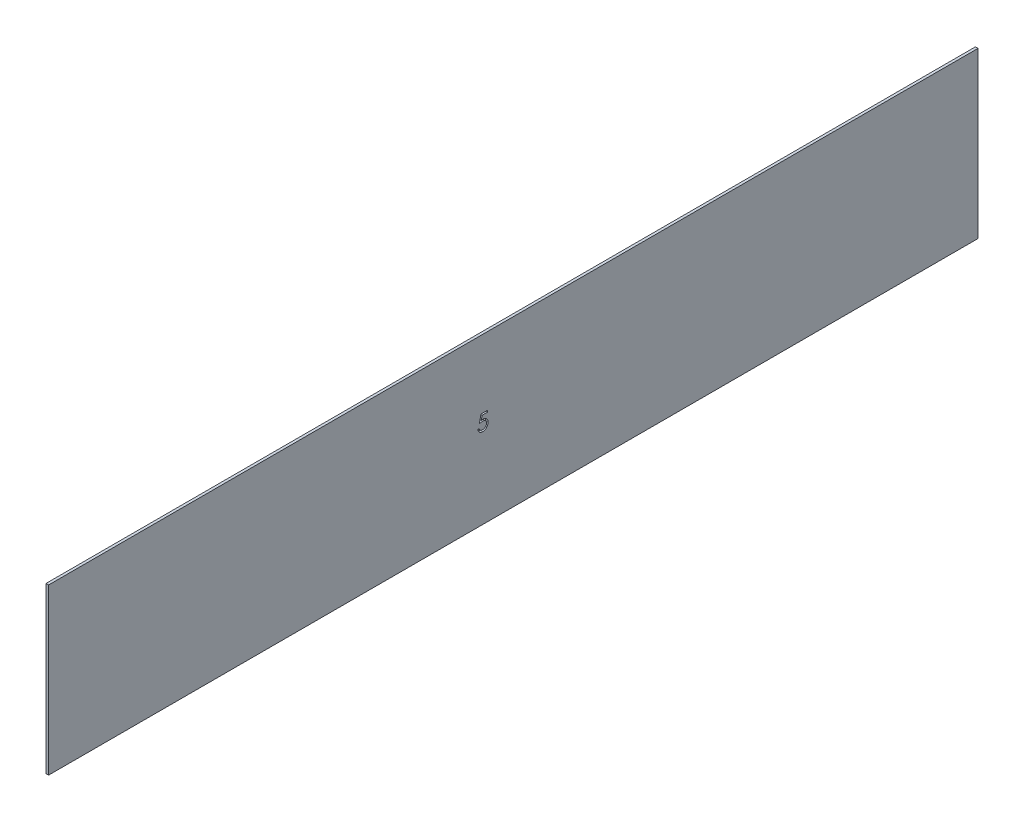
ISO-10303-21;
HEADER;
FILE_DESCRIPTION(('STEP AP214'),'2;1');
FILE_NAME('part.step','',(''),(''),'','','');
FILE_SCHEMA(('AUTOMOTIVE_DESIGN { 1 0 10303 214 1 1 1 1 }'));
ENDSEC;
DATA;
#1=APPLICATION_CONTEXT('core data for automotive mechanical design processes');
#2=APPLICATION_PROTOCOL_DEFINITION('international standard','automotive_design',2000,#1);
#3=PRODUCT_CONTEXT('',#1,'mechanical');
#4=PRODUCT('Part','Part','',(#3));
#5=PRODUCT_RELATED_PRODUCT_CATEGORY('part','',(#4));
#6=PRODUCT_DEFINITION_FORMATION('','',#4);
#7=PRODUCT_DEFINITION_CONTEXT('part definition',#1,'design');
#8=PRODUCT_DEFINITION('design','',#6,#7);
#9=PRODUCT_DEFINITION_SHAPE('','',#8);
#10=(LENGTH_UNIT() NAMED_UNIT(*) SI_UNIT(.MILLI.,.METRE.));
#11=(NAMED_UNIT(*) PLANE_ANGLE_UNIT() SI_UNIT($,.RADIAN.));
#12=(NAMED_UNIT(*) SI_UNIT($,.STERADIAN.) SOLID_ANGLE_UNIT());
#13=UNCERTAINTY_MEASURE_WITH_UNIT(LENGTH_MEASURE(1.E-05),#10,'distance_accuracy_value','');
#14=(GEOMETRIC_REPRESENTATION_CONTEXT(3) GLOBAL_UNCERTAINTY_ASSIGNED_CONTEXT((#13)) GLOBAL_UNIT_ASSIGNED_CONTEXT((#10,
#11,#12)) REPRESENTATION_CONTEXT('',''));
#15=CARTESIAN_POINT('',(0.,0.,0.));
#16=DIRECTION('',(0.,0.,1.));
#17=DIRECTION('',(1.,0.,0.));
#18=AXIS2_PLACEMENT_3D('',#15,#16,#17);
#19=CARTESIAN_POINT('',(0.,-91.3161345811033,-1228.84437187374));
#20=CARTESIAN_POINT('',(0.,-91.3192946558324,-1228.69671298981));
#21=CARTESIAN_POINT('',(0.,-91.3258194084311,-1228.39183485582));
#22=CARTESIAN_POINT('',(0.,-91.3738607697288,-1227.92416918463));
#23=CARTESIAN_POINT('',(0.,-91.4513632151162,-1227.43272423528));
#24=CARTESIAN_POINT('',(0.,-91.5579683620556,-1226.91938390947));
#25=CARTESIAN_POINT('',(0.,-91.6974746512704,-1226.38260657251));
#26=CARTESIAN_POINT('',(0.,-91.8646492903896,-1225.82352499141));
#27=CARTESIAN_POINT('',(0.,-92.0645218833878,-1225.24096365463));
#28=CARTESIAN_POINT('',(0.,-92.2154643610661,-1224.84843718326));
#29=CARTESIAN_POINT('',(0.,-92.2930576580264,-1224.64665552758));
#30=B_SPLINE_CURVE_WITH_KNOTS('',3,(#19,#20,#21,#22,#23,#24,#25,#26,#27,#28,#29),.UNSPECIFIED.,
.F.,.F.,(4,1,1,1,1,1,1,1,4),(0.,0.102203037035223,0.211023342373878,0.325099661565207,
0.446502097134894,0.573787717648855,0.708900709766069,0.850357871293403,1.),.UNSPECIFIED.);
#31=DIRECTION('',(1.,0.,0.));
#32=VECTOR('',#31,1.);
#33=SURFACE_OF_LINEAR_EXTRUSION('',#30,#32);
#34=DIRECTION('',(-1.,0.,0.));
#35=VECTOR('',#34,1.);
#36=CARTESIAN_POINT('',(0.,-92.2930576580264,-1224.64665552758));
#37=LINE('',#36,#35);
#38=CARTESIAN_POINT('',(3.175,-92.2930576580264,-1224.64665552758));
#39=VERTEX_POINT('',#38);
#40=CARTESIAN_POINT('',(0.,-92.2930576580264,-1224.64665552758));
#41=VERTEX_POINT('',#40);
#42=EDGE_CURVE('E11',#39,#41,#37,.T.);
#43=ORIENTED_EDGE('',*,*,#42,.F.);
#44=CARTESIAN_POINT('',(3.175,-91.3161345811033,-1228.84437187374));
#45=CARTESIAN_POINT('',(3.175,-91.3192946558324,-1228.69671298981));
#46=CARTESIAN_POINT('',(3.175,-91.3258194084311,-1228.39183485582));
#47=CARTESIAN_POINT('',(3.175,-91.3738607697288,-1227.92416918463));
#48=CARTESIAN_POINT('',(3.175,-91.4513632151162,-1227.43272423528));
#49=CARTESIAN_POINT('',(3.175,-91.5579683620556,-1226.91938390947));
#50=CARTESIAN_POINT('',(3.175,-91.6974746512704,-1226.38260657251));
#51=CARTESIAN_POINT('',(3.175,-91.8646492903896,-1225.82352499141));
#52=CARTESIAN_POINT('',(3.175,-92.0645218833878,-1225.24096365463));
#53=CARTESIAN_POINT('',(3.175,-92.2154643610661,-1224.84843718326));
#54=CARTESIAN_POINT('',(3.175,-92.2930576580264,-1224.64665552758));
#55=B_SPLINE_CURVE_WITH_KNOTS('',3,(#44,#45,#46,#47,#48,#49,#50,#51,#52,#53,#54),.UNSPECIFIED.,
.F.,.F.,(4,1,1,1,1,1,1,1,4),(0.,0.102203037035223,0.211023342373878,0.325099661565207,
0.446502097134894,0.573787717648855,0.708900709766069,0.850357871293403,1.),.UNSPECIFIED.);
#56=CARTESIAN_POINT('',(3.175,-91.3161345811033,-1228.84437187374));
#57=VERTEX_POINT('',#56);
#58=EDGE_CURVE('E143',#57,#39,#55,.T.);
#59=ORIENTED_EDGE('',*,*,#58,.F.);
#60=DIRECTION('',(-1.,0.,0.));
#61=VECTOR('',#60,1.);
#62=CARTESIAN_POINT('',(0.,-91.3161345811033,-1228.84437187374));
#63=LINE('',#62,#61);
#64=CARTESIAN_POINT('',(0.,-91.3161345811033,-1228.84437187374));
#65=VERTEX_POINT('',#64);
#66=EDGE_CURVE('E55',#57,#65,#63,.T.);
#67=ORIENTED_EDGE('',*,*,#66,.T.);
#68=EDGE_CURVE('E274',#65,#41,#30,.T.);
#69=ORIENTED_EDGE('',*,*,#68,.T.);
#70=EDGE_LOOP('',(#43,#59,#67,#69));
#71=FACE_BOUND('',#70,.T.);
#72=ADVANCED_FACE('F45',(#71),#33,.T.);
#73=CARTESIAN_POINT('',(0.,-95.5214831387956,-1233.43896321989));
#74=CARTESIAN_POINT('',(0.,-95.3686708335431,-1233.43537921025));
#75=CARTESIAN_POINT('',(0.,-95.0695624888284,-1233.42836402133));
#76=CARTESIAN_POINT('',(0.,-94.6319610937697,-1233.37104763154));
#77=CARTESIAN_POINT('',(0.,-94.2179063920996,-1233.27135096773));
#78=CARTESIAN_POINT('',(0.,-93.8253989186236,-1233.13297242116));
#79=CARTESIAN_POINT('',(0.,-93.4540684681293,-1232.95727967192));
#80=CARTESIAN_POINT('',(0.,-93.1035318118968,-1232.74257902916));
#81=CARTESIAN_POINT('',(0.,-92.7784090910661,-1232.48484124892));
#82=CARTESIAN_POINT('',(0.,-92.4785481921344,-1232.19042682675));
#83=CARTESIAN_POINT('',(0.,-92.2018068017536,-1231.86789377533));
#84=CARTESIAN_POINT('',(0.,-91.965891131208,-1231.51169283348));
#85=CARTESIAN_POINT('',(0.,-91.7674232365602,-1231.12927808907));
#86=CARTESIAN_POINT('',(0.,-91.5961474170089,-1230.72525698339));
#87=CARTESIAN_POINT('',(0.,-91.4731347884782,-1230.29001946393));
#88=CARTESIAN_POINT('',(0.,-91.3807810120005,-1229.83218465055));
#89=CARTESIAN_POINT('',(0.,-91.3273573951374,-1229.34680856873));
#90=CARTESIAN_POINT('',(0.,-91.3199448312636,-1229.01495382331));
#91=CARTESIAN_POINT('',(0.,-91.3161345811033,-1228.84437187374));
#92=B_SPLINE_CURVE_WITH_KNOTS('',3,(#73,#74,#75,#76,#77,#78,#79,#80,#81,#82,#83,#84,#85,#86,#87,
#88,#89,#90,#91),.UNSPECIFIED.,.F.,.F.,(4,1,1,1,1,1,1,1,1,1,1,1,1,1,1,1,4),(0.,
0.0653513820265936,0.127916031830613,0.1883602055717,0.247216077265452,0.305630129197413,
0.363769839831819,0.422660913912781,0.482687294090392,0.54330022123956,0.604117955323103,
0.664964891265284,0.727413494112564,0.791467625149423,0.858055442729101,0.92703681461495,1.),.UNSPECIFIED.);
#93=DIRECTION('',(1.,0.,0.));
#94=VECTOR('',#93,1.);
#95=SURFACE_OF_LINEAR_EXTRUSION('',#92,#94);
#96=ORIENTED_EDGE('',*,*,#66,.F.);
#97=CARTESIAN_POINT('',(3.175,-95.5214831387956,-1233.43896321989));
#98=CARTESIAN_POINT('',(3.175,-95.3686708335431,-1233.43537921025));
#99=CARTESIAN_POINT('',(3.175,-95.0695624888284,-1233.42836402133));
#100=CARTESIAN_POINT('',(3.175,-94.6319610937697,-1233.37104763154));
#101=CARTESIAN_POINT('',(3.175,-94.2179063920996,-1233.27135096773));
#102=CARTESIAN_POINT('',(3.175,-93.8253989186236,-1233.13297242116));
#103=CARTESIAN_POINT('',(3.175,-93.4540684681293,-1232.95727967192));
#104=CARTESIAN_POINT('',(3.175,-93.1035318118968,-1232.74257902916));
#105=CARTESIAN_POINT('',(3.175,-92.7784090910661,-1232.48484124892));
#106=CARTESIAN_POINT('',(3.175,-92.4785481921344,-1232.19042682675));
#107=CARTESIAN_POINT('',(3.175,-92.2018068017536,-1231.86789377533));
#108=CARTESIAN_POINT('',(3.175,-91.965891131208,-1231.51169283348));
#109=CARTESIAN_POINT('',(3.175,-91.7674232365602,-1231.12927808907));
#110=CARTESIAN_POINT('',(3.175,-91.5961474170089,-1230.72525698339));
#111=CARTESIAN_POINT('',(3.175,-91.4731347884782,-1230.29001946393));
#112=CARTESIAN_POINT('',(3.175,-91.3807810120005,-1229.83218465055));
#113=CARTESIAN_POINT('',(3.175,-91.3273573951374,-1229.34680856873));
#114=CARTESIAN_POINT('',(3.175,-91.3199448312636,-1229.01495382331));
#115=CARTESIAN_POINT('',(3.175,-91.3161345811033,-1228.84437187374));
#116=B_SPLINE_CURVE_WITH_KNOTS('',3,(#97,#98,#99,#100,#101,#102,#103,#104,#105,#106,#107,#108,
#109,#110,#111,#112,#113,#114,#115),.UNSPECIFIED.,.F.,.F.,(4,1,1,1,1,1,1,1,1,1,1,1,1,1,1,1,4),
(0.,0.0653513820265936,0.127916031830613,0.1883602055717,0.247216077265452,0.305630129197413,
0.363769839831819,0.422660913912781,0.482687294090392,0.54330022123956,0.604117955323103,
0.664964891265284,0.727413494112564,0.791467625149423,0.858055442729101,0.92703681461495,1.),.UNSPECIFIED.);
#117=CARTESIAN_POINT('',(3.175,-95.5214831387956,-1233.43896321989));
#118=VERTEX_POINT('',#117);
#119=EDGE_CURVE('E212',#118,#57,#116,.T.);
#120=ORIENTED_EDGE('',*,*,#119,.F.);
#121=DIRECTION('',(-1.,0.,0.));
#122=VECTOR('',#121,1.);
#123=CARTESIAN_POINT('',(0.,-95.5214831387956,-1233.43896321989));
#124=LINE('',#123,#122);
#125=CARTESIAN_POINT('',(0.,-95.5214831387956,-1233.43896321989));
#126=VERTEX_POINT('',#125);
#127=EDGE_CURVE('E267',#118,#126,#124,.T.);
#128=ORIENTED_EDGE('',*,*,#127,.T.);
#129=EDGE_CURVE('E284',#126,#65,#92,.T.);
#130=ORIENTED_EDGE('',*,*,#129,.T.);
#131=EDGE_LOOP('',(#96,#120,#128,#130));
#132=FACE_BOUND('',#131,.T.);
#133=ADVANCED_FACE('F287',(#132),#95,.T.);
#134=CARTESIAN_POINT('',(0.,-100.352673042642,-1228.60395721028));
#135=CARTESIAN_POINT('',(0.,-100.348205665758,-1228.76701674346));
#136=CARTESIAN_POINT('',(0.,-100.339409364121,-1229.08808229852));
#137=CARTESIAN_POINT('',(0.,-100.271705598318,-1229.56058427466));
#138=CARTESIAN_POINT('',(0.,-100.167433674486,-1230.01676577567));
#139=CARTESIAN_POINT('',(0.,-100.011387749503,-1230.45212553175));
#140=CARTESIAN_POINT('',(0.,-99.8217329249283,-1230.87428191151));
#141=CARTESIAN_POINT('',(0.,-99.5783551551305,-1231.27255629053));
#142=CARTESIAN_POINT('',(0.,-99.2982656261655,-1231.65847052182));
#143=CARTESIAN_POINT('',(0.,-98.977373111215,-1232.02002936284));
#144=CARTESIAN_POINT('',(0.,-98.6237523447874,-1232.35116979381));
#145=CARTESIAN_POINT('',(0.,-98.2455968177175,-1232.6437566817));
#146=CARTESIAN_POINT('',(0.,-97.8421894101056,-1232.88747102478));
#147=CARTESIAN_POINT('',(0.,-97.4205141067313,-1233.09285238877));
#148=CARTESIAN_POINT('',(0.,-96.9759493883744,-1233.24880820093));
#149=CARTESIAN_POINT('',(0.,-96.5105787063644,-1233.36006554159));
#150=CARTESIAN_POINT('',(0.,-96.0232525998123,-1233.42539647601));
#151=CARTESIAN_POINT('',(0.,-95.6908610708874,-1233.43438361272));
#152=CARTESIAN_POINT('',(0.,-95.5214831387956,-1233.43896321989));
#153=B_SPLINE_CURVE_WITH_KNOTS('',3,(#134,#135,#136,#137,#138,#139,#140,#141,#142,#143,#144,
#145,#146,#147,#148,#149,#150,#151,#152),.UNSPECIFIED.,.F.,.F.,(4,1,1,1,1,1,1,1,1,1,1,1,1,1,1,1,
4),(0.,0.064207295282987,0.126424689779743,0.187680284264923,0.248216424455216,
0.308305060008616,0.369660991325144,0.431698551786783,0.495946892208766,0.559758023972119,
0.622295407826159,0.683910635284175,0.745092408056624,0.806740225389292,0.869086618121201,
0.9332900029748,1.),.UNSPECIFIED.);
#154=DIRECTION('',(1.,0.,0.));
#155=VECTOR('',#154,1.);
#156=SURFACE_OF_LINEAR_EXTRUSION('',#153,#155);
#157=ORIENTED_EDGE('',*,*,#127,.F.);
#158=CARTESIAN_POINT('',(3.175,-100.352673042642,-1228.60395721028));
#159=CARTESIAN_POINT('',(3.175,-100.348205665758,-1228.76701674346));
#160=CARTESIAN_POINT('',(3.175,-100.339409364121,-1229.08808229852));
#161=CARTESIAN_POINT('',(3.175,-100.271705598318,-1229.56058427466));
#162=CARTESIAN_POINT('',(3.175,-100.167433674486,-1230.01676577567));
#163=CARTESIAN_POINT('',(3.175,-100.011387749503,-1230.45212553175));
#164=CARTESIAN_POINT('',(3.175,-99.8217329249283,-1230.87428191151));
#165=CARTESIAN_POINT('',(3.175,-99.5783551551305,-1231.27255629053));
#166=CARTESIAN_POINT('',(3.175,-99.2982656261655,-1231.65847052182));
#167=CARTESIAN_POINT('',(3.175,-98.977373111215,-1232.02002936284));
#168=CARTESIAN_POINT('',(3.175,-98.6237523447874,-1232.35116979381));
#169=CARTESIAN_POINT('',(3.175,-98.2455968177175,-1232.6437566817));
#170=CARTESIAN_POINT('',(3.175,-97.8421894101056,-1232.88747102478));
#171=CARTESIAN_POINT('',(3.175,-97.4205141067313,-1233.09285238877));
#172=CARTESIAN_POINT('',(3.175,-96.9759493883744,-1233.24880820093));
#173=CARTESIAN_POINT('',(3.175,-96.5105787063644,-1233.36006554159));
#174=CARTESIAN_POINT('',(3.175,-96.0232525998123,-1233.42539647601));
#175=CARTESIAN_POINT('',(3.175,-95.6908610708874,-1233.43438361272));
#176=CARTESIAN_POINT('',(3.175,-95.5214831387956,-1233.43896321989));
#177=B_SPLINE_CURVE_WITH_KNOTS('',3,(#158,#159,#160,#161,#162,#163,#164,#165,#166,#167,#168,
#169,#170,#171,#172,#173,#174,#175,#176),.UNSPECIFIED.,.F.,.F.,(4,1,1,1,1,1,1,1,1,1,1,1,1,1,1,1,
4),(0.,0.064207295282987,0.126424689779743,0.187680284264923,0.248216424455216,
0.308305060008616,0.369660991325144,0.431698551786783,0.495946892208766,0.559758023972119,
0.622295407826159,0.683910635284175,0.745092408056624,0.806740225389292,0.869086618121201,
0.9332900029748,1.),.UNSPECIFIED.);
#178=CARTESIAN_POINT('',(3.175,-100.352673042642,-1228.60395721028));
#179=VERTEX_POINT('',#178);
#180=EDGE_CURVE('E204',#179,#118,#177,.T.);
#181=ORIENTED_EDGE('',*,*,#180,.F.);
#182=DIRECTION('',(-1.,0.,0.));
#183=VECTOR('',#182,1.);
#184=CARTESIAN_POINT('',(0.,-100.352673042642,-1228.60395721028));
#185=LINE('',#184,#183);
#186=CARTESIAN_POINT('',(0.,-100.352673042642,-1228.60395721028));
#187=VERTEX_POINT('',#186);
#188=EDGE_CURVE('E264',#179,#187,#185,.T.);
#189=ORIENTED_EDGE('',*,*,#188,.T.);
#190=EDGE_CURVE('E288',#187,#126,#153,.T.);
#191=ORIENTED_EDGE('',*,*,#190,.T.);
#192=EDGE_LOOP('',(#157,#181,#189,#191));
#193=FACE_BOUND('',#192,.T.);
#194=ADVANCED_FACE('F309',(#193),#156,.T.);
#195=CARTESIAN_POINT('',(0.,-96.933442273411,-1224.40242475835));
#196=CARTESIAN_POINT('',(0.,-97.1151055360244,-1224.44449019215));
#197=CARTESIAN_POINT('',(0.,-97.4642724138275,-1224.52534229163));
#198=CARTESIAN_POINT('',(0.,-97.9548444287975,-1224.70281072413));
#199=CARTESIAN_POINT('',(0.,-98.3920104890912,-1224.9197949892));
#200=CARTESIAN_POINT('',(0.,-98.7815535066229,-1225.17781008558));
#201=CARTESIAN_POINT('',(0.,-99.1212367632051,-1225.48560382295));
#202=CARTESIAN_POINT('',(0.,-99.4239524860378,-1225.83682828618));
#203=CARTESIAN_POINT('',(0.,-99.697048547092,-1226.23060660816));
#204=CARTESIAN_POINT('',(0.,-99.9246838942659,-1226.66817547169));
#205=CARTESIAN_POINT('',(0.,-100.118823823486,-1227.12980094628));
#206=CARTESIAN_POINT('',(0.,-100.248100906009,-1227.61294818933));
#207=CARTESIAN_POINT('',(0.,-100.33900147991,-1228.10446184655));
#208=CARTESIAN_POINT('',(0.,-100.348100635131,-1228.43690269005));
#209=CARTESIAN_POINT('',(0.,-100.352673042642,-1228.60395721028));
#210=B_SPLINE_CURVE_WITH_KNOTS('',3,(#195,#196,#197,#198,#199,#200,#201,#202,#203,#204,#205,
#206,#207,#208,#209),.UNSPECIFIED.,.F.,.F.,(4,1,1,1,1,1,1,1,1,1,1,1,4),(0.,0.0946872518675544,
0.181994155707275,0.264376948610513,0.342179861947775,0.418617610862148,0.496509075371912,
0.577369091611736,0.661510592454202,0.746732550829199,0.831257984327746,0.915205616213655,1.),.UNSPECIFIED.);
#211=DIRECTION('',(1.,0.,0.));
#212=VECTOR('',#211,1.);
#213=SURFACE_OF_LINEAR_EXTRUSION('',#210,#212);
#214=ORIENTED_EDGE('',*,*,#188,.F.);
#215=CARTESIAN_POINT('',(3.175,-96.933442273411,-1224.40242475835));
#216=CARTESIAN_POINT('',(3.175,-97.1151055360244,-1224.44449019215));
#217=CARTESIAN_POINT('',(3.175,-97.4642724138275,-1224.52534229163));
#218=CARTESIAN_POINT('',(3.175,-97.9548444287975,-1224.70281072413));
#219=CARTESIAN_POINT('',(3.175,-98.3920104890912,-1224.9197949892));
#220=CARTESIAN_POINT('',(3.175,-98.7815535066229,-1225.17781008558));
#221=CARTESIAN_POINT('',(3.175,-99.1212367632051,-1225.48560382295));
#222=CARTESIAN_POINT('',(3.175,-99.4239524860378,-1225.83682828618));
#223=CARTESIAN_POINT('',(3.175,-99.697048547092,-1226.23060660816));
#224=CARTESIAN_POINT('',(3.175,-99.9246838942659,-1226.66817547169));
#225=CARTESIAN_POINT('',(3.175,-100.118823823486,-1227.12980094628));
#226=CARTESIAN_POINT('',(3.175,-100.248100906009,-1227.61294818933));
#227=CARTESIAN_POINT('',(3.175,-100.33900147991,-1228.10446184655));
#228=CARTESIAN_POINT('',(3.175,-100.348100635131,-1228.43690269005));
#229=CARTESIAN_POINT('',(3.175,-100.352673042642,-1228.60395721028));
#230=B_SPLINE_CURVE_WITH_KNOTS('',3,(#215,#216,#217,#218,#219,#220,#221,#222,#223,#224,#225,
#226,#227,#228,#229),.UNSPECIFIED.,.F.,.F.,(4,1,1,1,1,1,1,1,1,1,1,1,4),(0.,0.0946872518675544,
0.181994155707275,0.264376948610513,0.342179861947775,0.418617610862148,0.496509075371912,
0.577369091611736,0.661510592454202,0.746732550829199,0.831257984327746,0.915205616213655,1.),.UNSPECIFIED.);
#231=CARTESIAN_POINT('',(3.175,-96.933442273411,-1224.40242475835));
#232=VERTEX_POINT('',#231);
#233=EDGE_CURVE('E199',#232,#179,#230,.T.);
#234=ORIENTED_EDGE('',*,*,#233,.F.);
#235=DIRECTION('',(-1.,0.,0.));
#236=VECTOR('',#235,1.);
#237=CARTESIAN_POINT('',(0.,-96.933442273411,-1224.40242475835));
#238=LINE('',#237,#236);
#239=CARTESIAN_POINT('',(0.,-96.933442273411,-1224.40242475835));
#240=VERTEX_POINT('',#239);
#241=EDGE_CURVE('E261',#232,#240,#238,.T.);
#242=ORIENTED_EDGE('',*,*,#241,.T.);
#243=EDGE_CURVE('E290',#240,#187,#210,.T.);
#244=ORIENTED_EDGE('',*,*,#243,.T.);
#245=EDGE_LOOP('',(#214,#234,#242,#244));
#246=FACE_BOUND('',#245,.T.);
#247=ADVANCED_FACE('F330',(#246),#213,.T.);
#248=CARTESIAN_POINT('',(0.,-96.933442273411,-1222.69280937374));
#249=DIRECTION('',(0.,-1.,0.));
#250=DIRECTION('',(0.,0.,-1.));
#251=AXIS2_PLACEMENT_3D('',#248,#249,#250);
#252=PLANE('',#251);
#253=ORIENTED_EDGE('',*,*,#241,.F.);
#254=DIRECTION('',(0.,0.,1.));
#255=VECTOR('',#254,1.);
#256=CARTESIAN_POINT('',(3.175,-96.933442273411,-2105.025));
#257=LINE('',#256,#255);
#258=CARTESIAN_POINT('',(3.175,-96.933442273411,-1222.69280937374));
#259=VERTEX_POINT('',#258);
#260=EDGE_CURVE('E193',#259,#232,#257,.F.);
#261=ORIENTED_EDGE('',*,*,#260,.F.);
#262=DIRECTION('',(-1.,0.,0.));
#263=VECTOR('',#262,1.);
#264=CARTESIAN_POINT('',(0.,-96.933442273411,-1222.69280937374));
#265=LINE('',#264,#263);
#266=CARTESIAN_POINT('',(0.,-96.933442273411,-1222.69280937374));
#267=VERTEX_POINT('',#266);
#268=EDGE_CURVE('E258',#259,#267,#265,.T.);
#269=ORIENTED_EDGE('',*,*,#268,.T.);
#270=DIRECTION('',(0.,0.,-1.));
#271=VECTOR('',#270,1.);
#272=CARTESIAN_POINT('',(0.,-96.933442273411,-1222.69280937374));
#273=LINE('',#272,#271);
#274=EDGE_CURVE('E562',#267,#240,#273,.T.);
#275=ORIENTED_EDGE('',*,*,#274,.T.);
#276=EDGE_LOOP('',(#253,#261,#269,#275));
#277=FACE_BOUND('',#276,.T.);
#278=ADVANCED_FACE('F338',(#277),#252,.T.);
#279=CARTESIAN_POINT('',(0.,-102.306519196488,-1228.50473846028));
#280=CARTESIAN_POINT('',(0.,-102.302759064031,-1228.31492327674));
#281=CARTESIAN_POINT('',(0.,-102.295361447622,-1227.94148432677));
#282=CARTESIAN_POINT('',(0.,-102.217972263597,-1227.39436524028));
#283=CARTESIAN_POINT('',(0.,-102.107134375803,-1226.86796145786));
#284=CARTESIAN_POINT('',(0.,-101.940385535628,-1226.3665104787));
#285=CARTESIAN_POINT('',(0.,-101.731448974529,-1225.88551831482));
#286=CARTESIAN_POINT('',(0.,-101.467382383961,-1225.43146037943));
#287=CARTESIAN_POINT('',(0.,-101.168138976423,-1224.99273465551));
#288=CARTESIAN_POINT('',(0.,-100.815004483858,-1224.58717628406));
#289=CARTESIAN_POINT('',(0.,-100.429020557367,-1224.21076943789));
#290=CARTESIAN_POINT('',(0.,-100.01015111045,-1223.87382115389));
#291=CARTESIAN_POINT('',(0.,-99.5653094328101,-1223.57373697194));
#292=CARTESIAN_POINT('',(0.,-99.0923351941981,-1223.31532237762));
#293=CARTESIAN_POINT('',(0.,-98.5924711900946,-1223.09489743302));
#294=CARTESIAN_POINT('',(0.,-98.0638445709542,-1222.92173299683));
#295=CARTESIAN_POINT('',(0.,-97.5092174066554,-1222.78196937921));
#296=CARTESIAN_POINT('',(0.,-97.127381871421,-1222.72284133348));
#297=CARTESIAN_POINT('',(0.,-96.933442273411,-1222.69280937374));
#298=B_SPLINE_CURVE_WITH_KNOTS('',3,(#279,#280,#281,#282,#283,#284,#285,#286,#287,#288,#289,
#290,#291,#292,#293,#294,#295,#296,#297),.UNSPECIFIED.,.F.,.F.,(4,1,1,1,1,1,1,1,1,1,1,1,1,1,1,1,
4),(0.,0.0654211437588912,0.128708371881883,0.190236141863538,0.250724402033538,
0.310637179413443,0.370766408289726,0.431614744412353,0.493522973566353,0.555883455377532,
0.617342367318509,0.678668039097274,0.740711359545147,0.802985362512744,0.866802580265517,
0.932347171345887,1.),.UNSPECIFIED.);
#299=DIRECTION('',(1.,0.,0.));
#300=VECTOR('',#299,1.);
#301=SURFACE_OF_LINEAR_EXTRUSION('',#298,#300);
#302=ORIENTED_EDGE('',*,*,#268,.F.);
#303=CARTESIAN_POINT('',(3.175,-102.306519196488,-1228.50473846028));
#304=CARTESIAN_POINT('',(3.175,-102.302759064031,-1228.31492327674));
#305=CARTESIAN_POINT('',(3.175,-102.295361447622,-1227.94148432677));
#306=CARTESIAN_POINT('',(3.175,-102.217972263597,-1227.39436524028));
#307=CARTESIAN_POINT('',(3.175,-102.107134375803,-1226.86796145786));
#308=CARTESIAN_POINT('',(3.175,-101.940385535628,-1226.3665104787));
#309=CARTESIAN_POINT('',(3.175,-101.731448974529,-1225.88551831482));
#310=CARTESIAN_POINT('',(3.175,-101.467382383961,-1225.43146037943));
#311=CARTESIAN_POINT('',(3.175,-101.168138976423,-1224.99273465551));
#312=CARTESIAN_POINT('',(3.175,-100.815004483858,-1224.58717628406));
#313=CARTESIAN_POINT('',(3.175,-100.429020557367,-1224.21076943789));
#314=CARTESIAN_POINT('',(3.175,-100.01015111045,-1223.87382115389));
#315=CARTESIAN_POINT('',(3.175,-99.5653094328101,-1223.57373697194));
#316=CARTESIAN_POINT('',(3.175,-99.0923351941981,-1223.31532237762));
#317=CARTESIAN_POINT('',(3.175,-98.5924711900946,-1223.09489743302));
#318=CARTESIAN_POINT('',(3.175,-98.0638445709542,-1222.92173299683));
#319=CARTESIAN_POINT('',(3.175,-97.5092174066554,-1222.78196937921));
#320=CARTESIAN_POINT('',(3.175,-97.127381871421,-1222.72284133348));
#321=CARTESIAN_POINT('',(3.175,-96.933442273411,-1222.69280937374));
#322=B_SPLINE_CURVE_WITH_KNOTS('',3,(#303,#304,#305,#306,#307,#308,#309,#310,#311,#312,#313,
#314,#315,#316,#317,#318,#319,#320,#321),.UNSPECIFIED.,.F.,.F.,(4,1,1,1,1,1,1,1,1,1,1,1,1,1,1,1,
4),(0.,0.0654211437588912,0.128708371881883,0.190236141863538,0.250724402033538,
0.310637179413443,0.370766408289726,0.431614744412353,0.493522973566353,0.555883455377532,
0.617342367318509,0.678668039097274,0.740711359545147,0.802985362512744,0.866802580265517,
0.932347171345887,1.),.UNSPECIFIED.);
#323=CARTESIAN_POINT('',(3.175,-102.306519196488,-1228.50473846028));
#324=VERTEX_POINT('',#323);
#325=EDGE_CURVE('E185',#324,#259,#322,.T.);
#326=ORIENTED_EDGE('',*,*,#325,.F.);
#327=DIRECTION('',(-1.,0.,0.));
#328=VECTOR('',#327,1.);
#329=CARTESIAN_POINT('',(0.,-102.306519196488,-1228.50473846028));
#330=LINE('',#329,#328);
#331=CARTESIAN_POINT('',(0.,-102.306519196488,-1228.50473846028));
#332=VERTEX_POINT('',#331);
#333=EDGE_CURVE('E255',#324,#332,#330,.T.);
#334=ORIENTED_EDGE('',*,*,#333,.T.);
#335=EDGE_CURVE('E560',#332,#267,#298,.T.);
#336=ORIENTED_EDGE('',*,*,#335,.T.);
#337=EDGE_LOOP('',(#302,#326,#334,#336));
#338=FACE_BOUND('',#337,.T.);
#339=ADVANCED_FACE('F346',(#338),#301,.T.);
#340=CARTESIAN_POINT('',(0.,-95.593989148411,-1235.14857860451));
#341=CARTESIAN_POINT('',(0.,-95.7492315191838,-1235.14495869481));
#342=CARTESIAN_POINT('',(0.,-96.0576182944181,-1235.13776779535));
#343=CARTESIAN_POINT('',(0.,-96.515603158148,-1235.10119948258));
#344=CARTESIAN_POINT('',(0.,-96.9638922924962,-1235.030792228));
#345=CARTESIAN_POINT('',(0.,-97.4025451680755,-1234.93626218681));
#346=CARTESIAN_POINT('',(0.,-97.8307313223647,-1234.81356702617));
#347=CARTESIAN_POINT('',(0.,-98.2496763529375,-1234.66503660421));
#348=CARTESIAN_POINT('',(0.,-98.6567727124967,-1234.48326679734));
#349=CARTESIAN_POINT('',(0.,-99.0558723625547,-1234.28388745486));
#350=CARTESIAN_POINT('',(0.,-99.4379528088574,-1234.05938876726));
#351=CARTESIAN_POINT('',(0.,-99.7952708641826,-1233.8102228916));
#352=CARTESIAN_POINT('',(0.,-100.133186739095,-1233.54697643224));
#353=CARTESIAN_POINT('',(0.,-100.448076343045,-1233.26372260567));
#354=CARTESIAN_POINT('',(0.,-100.737870483291,-1232.95782861799));
#355=CARTESIAN_POINT('',(0.,-101.004288986916,-1232.63299908407));
#356=CARTESIAN_POINT('',(0.,-101.251837370423,-1232.29182599907));
#357=CARTESIAN_POINT('',(0.,-101.47046711845,-1231.92903103729));
#358=CARTESIAN_POINT('',(0.,-101.671651208367,-1231.55269838002));
#359=CARTESIAN_POINT('',(0.,-101.836697890149,-1231.15739336958));
#360=CARTESIAN_POINT('',(0.,-101.984256621583,-1230.75211441423));
#361=CARTESIAN_POINT('',(0.,-102.101874193298,-1230.3310284485));
#362=CARTESIAN_POINT('',(0.,-102.19403566861,-1229.8950892684));
#363=CARTESIAN_POINT('',(0.,-102.256631794746,-1229.44357827614));
#364=CARTESIAN_POINT('',(0.,-102.302223547263,-1228.97886348644));
#365=CARTESIAN_POINT('',(0.,-102.305077547237,-1228.66385806082));
#366=CARTESIAN_POINT('',(0.,-102.306519196488,-1228.50473846028));
#367=B_SPLINE_CURVE_WITH_KNOTS('',3,(#340,#341,#342,#343,#344,#345,#346,#347,#348,#349,#350,
#351,#352,#353,#354,#355,#356,#357,#358,#359,#360,#361,#362,#363,#364,#365,#366),.UNSPECIFIED.,
.F.,.F.,(4,1,1,1,1,1,1,1,1,1,1,1,1,1,1,1,1,1,1,1,1,1,1,1,4),(0.,0.0440144705761411,
0.0874341236677066,0.130118398657899,0.172553694558183,0.214554755968139,0.256298092097131,
0.298438225133251,0.340849002588096,0.382715188967027,0.423924045407533,0.464246243250418,
0.504073671461796,0.543861905868492,0.583566724979655,0.623094318852333,0.663229060768585,
0.703551258611471,0.743937894686186,0.784541254800093,0.825750111240596,0.867757363388507,
0.910745164032309,0.954914446891478,1.),.UNSPECIFIED.);
#368=DIRECTION('',(1.,0.,0.));
#369=VECTOR('',#368,1.);
#370=SURFACE_OF_LINEAR_EXTRUSION('',#367,#369);
#371=ORIENTED_EDGE('',*,*,#333,.F.);
#372=CARTESIAN_POINT('',(3.175,-95.593989148411,-1235.14857860451));
#373=CARTESIAN_POINT('',(3.175,-95.7492315191838,-1235.14495869481));
#374=CARTESIAN_POINT('',(3.175,-96.0576182944181,-1235.13776779535));
#375=CARTESIAN_POINT('',(3.175,-96.515603158148,-1235.10119948258));
#376=CARTESIAN_POINT('',(3.175,-96.9638922924962,-1235.030792228));
#377=CARTESIAN_POINT('',(3.175,-97.4025451680755,-1234.93626218681));
#378=CARTESIAN_POINT('',(3.175,-97.8307313223647,-1234.81356702617));
#379=CARTESIAN_POINT('',(3.175,-98.2496763529375,-1234.66503660421));
#380=CARTESIAN_POINT('',(3.175,-98.6567727124967,-1234.48326679734));
#381=CARTESIAN_POINT('',(3.175,-99.0558723625547,-1234.28388745486));
#382=CARTESIAN_POINT('',(3.175,-99.4379528088574,-1234.05938876726));
#383=CARTESIAN_POINT('',(3.175,-99.7952708641826,-1233.8102228916));
#384=CARTESIAN_POINT('',(3.175,-100.133186739095,-1233.54697643224));
#385=CARTESIAN_POINT('',(3.175,-100.448076343045,-1233.26372260567));
#386=CARTESIAN_POINT('',(3.175,-100.737870483291,-1232.95782861799));
#387=CARTESIAN_POINT('',(3.175,-101.004288986916,-1232.63299908407));
#388=CARTESIAN_POINT('',(3.175,-101.251837370423,-1232.29182599907));
#389=CARTESIAN_POINT('',(3.175,-101.47046711845,-1231.92903103729));
#390=CARTESIAN_POINT('',(3.175,-101.671651208367,-1231.55269838002));
#391=CARTESIAN_POINT('',(3.175,-101.836697890149,-1231.15739336958));
#392=CARTESIAN_POINT('',(3.175,-101.984256621583,-1230.75211441423));
#393=CARTESIAN_POINT('',(3.175,-102.101874193298,-1230.3310284485));
#394=CARTESIAN_POINT('',(3.175,-102.19403566861,-1229.8950892684));
#395=CARTESIAN_POINT('',(3.175,-102.256631794746,-1229.44357827614));
#396=CARTESIAN_POINT('',(3.175,-102.302223547263,-1228.97886348644));
#397=CARTESIAN_POINT('',(3.175,-102.305077547237,-1228.66385806082));
#398=CARTESIAN_POINT('',(3.175,-102.306519196488,-1228.50473846028));
#399=B_SPLINE_CURVE_WITH_KNOTS('',3,(#372,#373,#374,#375,#376,#377,#378,#379,#380,#381,#382,
#383,#384,#385,#386,#387,#388,#389,#390,#391,#392,#393,#394,#395,#396,#397,#398),.UNSPECIFIED.,
.F.,.F.,(4,1,1,1,1,1,1,1,1,1,1,1,1,1,1,1,1,1,1,1,1,1,1,1,4),(0.,0.0440144705761411,
0.0874341236677066,0.130118398657899,0.172553694558183,0.214554755968139,0.256298092097131,
0.298438225133251,0.340849002588096,0.382715188967027,0.423924045407533,0.464246243250418,
0.504073671461796,0.543861905868492,0.583566724979655,0.623094318852333,0.663229060768585,
0.703551258611471,0.743937894686186,0.784541254800093,0.825750111240596,0.867757363388507,
0.910745164032309,0.954914446891478,1.),.UNSPECIFIED.);
#400=CARTESIAN_POINT('',(3.175,-95.593989148411,-1235.14857860451));
#401=VERTEX_POINT('',#400);
#402=EDGE_CURVE('E177',#401,#324,#399,.T.);
#403=ORIENTED_EDGE('',*,*,#402,.F.);
#404=DIRECTION('',(-1.,0.,0.));
#405=VECTOR('',#404,1.);
#406=CARTESIAN_POINT('',(0.,-95.593989148411,-1235.14857860451));
#407=LINE('',#406,#405);
#408=CARTESIAN_POINT('',(0.,-95.593989148411,-1235.14857860451));
#409=VERTEX_POINT('',#408);
#410=EDGE_CURVE('E252',#401,#409,#407,.T.);
#411=ORIENTED_EDGE('',*,*,#410,.T.);
#412=EDGE_CURVE('E559',#409,#332,#367,.T.);
#413=ORIENTED_EDGE('',*,*,#412,.T.);
#414=EDGE_LOOP('',(#371,#403,#411,#413));
#415=FACE_BOUND('',#414,.T.);
#416=ADVANCED_FACE('F355',(#415),#370,.T.);
#417=CARTESIAN_POINT('',(0.,-89.3622884272572,-1229.15347644105));
#418=CARTESIAN_POINT('',(0.,-89.3668927343951,-1229.36620365291));
#419=CARTESIAN_POINT('',(0.,-89.375945952612,-1229.78447850121));
#420=CARTESIAN_POINT('',(0.,-89.4628784474446,-1230.39646762699));
#421=CARTESIAN_POINT('',(0.,-89.5997114113606,-1230.9806652315));
#422=CARTESIAN_POINT('',(0.,-89.7908673939561,-1231.5358495606));
#423=CARTESIAN_POINT('',(0.,-90.0353046560567,-1232.0630477005));
#424=CARTESIAN_POINT('',(0.,-90.3406486171471,-1232.55740914227));
#425=CARTESIAN_POINT('',(0.,-90.6973371766902,-1233.02635435439));
#426=CARTESIAN_POINT('',(0.,-91.1074293132132,-1233.46147047291));
#427=CARTESIAN_POINT('',(0.,-91.55875982725,-1233.85620992164));
#428=CARTESIAN_POINT('',(0.,-92.0440333825009,-1234.20327909397));
#429=CARTESIAN_POINT('',(0.,-92.5585339435478,-1234.49807833548));
#430=CARTESIAN_POINT('',(0.,-93.1071772568229,-1234.73517330131));
#431=CARTESIAN_POINT('',(0.,-93.6838977918136,-1234.92449946358));
#432=CARTESIAN_POINT('',(0.,-94.2947637054194,-1235.05051246409));
#433=CARTESIAN_POINT('',(0.,-94.9340170443494,-1235.13442340858));
#434=CARTESIAN_POINT('',(0.,-95.371103347198,-1235.14379811126));
#435=CARTESIAN_POINT('',(0.,-95.593989148411,-1235.14857860451));
#436=B_SPLINE_CURVE_WITH_KNOTS('',3,(#417,#418,#419,#420,#421,#422,#423,#424,#425,#426,#427,
#428,#429,#430,#431,#432,#433,#434,#435),.UNSPECIFIED.,.F.,.F.,(4,1,1,1,1,1,1,1,1,1,1,1,1,1,1,1,
4),(0.,0.0658076458106959,0.129394273668057,0.190894060632192,0.251281068929836,
0.310814964465276,0.370370987448246,0.430768262589727,0.492881250617504,0.55510394815525,
0.616067050993844,0.677256033174654,0.738259805199118,0.800762134376297,0.864777581574486,
0.931045294999404,1.),.UNSPECIFIED.);
#437=DIRECTION('',(1.,0.,0.));
#438=VECTOR('',#437,1.);
#439=SURFACE_OF_LINEAR_EXTRUSION('',#436,#438);
#440=ORIENTED_EDGE('',*,*,#410,.F.);
#441=CARTESIAN_POINT('',(3.175,-89.3622884272572,-1229.15347644105));
#442=CARTESIAN_POINT('',(3.175,-89.3668927343951,-1229.36620365291));
#443=CARTESIAN_POINT('',(3.175,-89.375945952612,-1229.78447850121));
#444=CARTESIAN_POINT('',(3.175,-89.4628784474446,-1230.39646762699));
#445=CARTESIAN_POINT('',(3.175,-89.5997114113606,-1230.9806652315));
#446=CARTESIAN_POINT('',(3.175,-89.7908673939561,-1231.5358495606));
#447=CARTESIAN_POINT('',(3.175,-90.0353046560567,-1232.0630477005));
#448=CARTESIAN_POINT('',(3.175,-90.3406486171471,-1232.55740914227));
#449=CARTESIAN_POINT('',(3.175,-90.6973371766902,-1233.02635435439));
#450=CARTESIAN_POINT('',(3.175,-91.1074293132132,-1233.46147047291));
#451=CARTESIAN_POINT('',(3.175,-91.55875982725,-1233.85620992164));
#452=CARTESIAN_POINT('',(3.175,-92.0440333825009,-1234.20327909397));
#453=CARTESIAN_POINT('',(3.175,-92.5585339435478,-1234.49807833548));
#454=CARTESIAN_POINT('',(3.175,-93.1071772568229,-1234.73517330131));
#455=CARTESIAN_POINT('',(3.175,-93.6838977918136,-1234.92449946358));
#456=CARTESIAN_POINT('',(3.175,-94.2947637054194,-1235.05051246409));
#457=CARTESIAN_POINT('',(3.175,-94.9340170443494,-1235.13442340858));
#458=CARTESIAN_POINT('',(3.175,-95.371103347198,-1235.14379811126));
#459=CARTESIAN_POINT('',(3.175,-95.593989148411,-1235.14857860451));
#460=B_SPLINE_CURVE_WITH_KNOTS('',3,(#441,#442,#443,#444,#445,#446,#447,#448,#449,#450,#451,
#452,#453,#454,#455,#456,#457,#458,#459),.UNSPECIFIED.,.F.,.F.,(4,1,1,1,1,1,1,1,1,1,1,1,1,1,1,1,
4),(0.,0.0658076458106959,0.129394273668057,0.190894060632192,0.251281068929836,
0.310814964465276,0.370370987448246,0.430768262589727,0.492881250617504,0.55510394815525,
0.616067050993844,0.677256033174654,0.738259805199118,0.800762134376297,0.864777581574486,
0.931045294999404,1.),.UNSPECIFIED.);
#461=CARTESIAN_POINT('',(3.175,-89.3622884272572,-1229.15347644105));
#462=VERTEX_POINT('',#461);
#463=EDGE_CURVE('E169',#462,#401,#460,.T.);
#464=ORIENTED_EDGE('',*,*,#463,.F.);
#465=DIRECTION('',(-1.,0.,0.));
#466=VECTOR('',#465,1.);
#467=CARTESIAN_POINT('',(0.,-89.3622884272572,-1229.15347644105));
#468=LINE('',#467,#466);
#469=CARTESIAN_POINT('',(0.,-89.3622884272572,-1229.15347644105));
#470=VERTEX_POINT('',#469);
#471=EDGE_CURVE('E249',#462,#470,#468,.T.);
#472=ORIENTED_EDGE('',*,*,#471,.T.);
#473=EDGE_CURVE('E484',#470,#409,#436,.T.);
#474=ORIENTED_EDGE('',*,*,#473,.T.);
#475=EDGE_LOOP('',(#440,#464,#472,#474));
#476=FACE_BOUND('',#475,.T.);
#477=ADVANCED_FACE('F364',(#476),#439,.T.);
#478=CARTESIAN_POINT('',(0.,-89.7324506868725,-1226.90960624874));
#479=CARTESIAN_POINT('',(0.,-89.6767687788767,-1227.11129607926));
#480=CARTESIAN_POINT('',(0.,-89.5688938887996,-1227.50203822657));
#481=CARTESIAN_POINT('',(0.,-89.4491196240334,-1228.07876261268));
#482=CARTESIAN_POINT('',(0.,-89.3769177070919,-1228.62627160585));
#483=CARTESIAN_POINT('',(0.,-89.3670590027328,-1228.98155612195));
#484=CARTESIAN_POINT('',(0.,-89.3622884272572,-1229.15347644105));
#485=B_SPLINE_CURVE_WITH_KNOTS('',3,(#478,#479,#480,#481,#482,#483,#484),.UNSPECIFIED.,.F.,.F.,
(4,1,1,1,4),(0.,0.275068369018739,0.53290146008994,0.773973459592446,1.),.UNSPECIFIED.);
#486=DIRECTION('',(1.,0.,0.));
#487=VECTOR('',#486,1.);
#488=SURFACE_OF_LINEAR_EXTRUSION('',#485,#487);
#489=ORIENTED_EDGE('',*,*,#471,.F.);
#490=CARTESIAN_POINT('',(3.175,-89.7324506868725,-1226.90960624874));
#491=CARTESIAN_POINT('',(3.175,-89.6767687788767,-1227.11129607926));
#492=CARTESIAN_POINT('',(3.175,-89.5688938887996,-1227.50203822657));
#493=CARTESIAN_POINT('',(3.175,-89.4491196240334,-1228.07876261268));
#494=CARTESIAN_POINT('',(3.175,-89.3769177070919,-1228.62627160585));
#495=CARTESIAN_POINT('',(3.175,-89.3670590027328,-1228.98155612195));
#496=CARTESIAN_POINT('',(3.175,-89.3622884272572,-1229.15347644105));
#497=B_SPLINE_CURVE_WITH_KNOTS('',3,(#490,#491,#492,#493,#494,#495,#496),.UNSPECIFIED.,.F.,.F.,
(4,1,1,1,4),(0.,0.275068369018739,0.53290146008994,0.773973459592446,1.),.UNSPECIFIED.);
#498=CARTESIAN_POINT('',(3.175,-89.7324506868725,-1226.90960624874));
#499=VERTEX_POINT('',#498);
#500=EDGE_CURVE('E164',#499,#462,#497,.T.);
#501=ORIENTED_EDGE('',*,*,#500,.F.);
#502=DIRECTION('',(-1.,0.,0.));
#503=VECTOR('',#502,1.);
#504=CARTESIAN_POINT('',(0.,-89.7324506868725,-1226.90960624874));
#505=LINE('',#504,#503);
#506=CARTESIAN_POINT('',(0.,-89.7324506868725,-1226.90960624874));
#507=VERTEX_POINT('',#506);
#508=EDGE_CURVE('E246',#499,#507,#505,.T.);
#509=ORIENTED_EDGE('',*,*,#508,.T.);
#510=EDGE_CURVE('E477',#507,#470,#485,.T.);
#511=ORIENTED_EDGE('',*,*,#510,.T.);
#512=EDGE_LOOP('',(#489,#501,#509,#511));
#513=FACE_BOUND('',#512,.T.);
#514=ADVANCED_FACE('F373',(#513),#488,.T.);
#515=CARTESIAN_POINT('',(0.,-84.7219038118725,-1227.93613870066));
#516=DIRECTION('',(0.,0.200705474463135,0.97965162814162));
#517=DIRECTION('',(0.,-0.97965162814162,0.200705474463135));
#518=AXIS2_PLACEMENT_3D('',#515,#516,#517);
#519=PLANE('',#518);
#520=ORIENTED_EDGE('',*,*,#508,.F.);
#521=DIRECTION('',(0.,-0.97965162814162,0.200705474463135));
#522=VECTOR('',#521,1.);
#523=CARTESIAN_POINT('',(3.175,-84.7219038118725,-1227.93613870066));
#524=LINE('',#523,#522);
#525=CARTESIAN_POINT('',(3.175,-84.7219038118725,-1227.93613870066));
#526=VERTEX_POINT('',#525);
#527=EDGE_CURVE('E161',#526,#499,#524,.T.);
#528=ORIENTED_EDGE('',*,*,#527,.F.);
#529=DIRECTION('',(-1.,0.,0.));
#530=VECTOR('',#529,1.);
#531=CARTESIAN_POINT('',(0.,-84.7219038118725,-1227.93613870066));
#532=LINE('',#531,#530);
#533=CARTESIAN_POINT('',(0.,-84.7219038118725,-1227.93613870066));
#534=VERTEX_POINT('',#533);
#535=EDGE_CURVE('E243',#526,#534,#532,.T.);
#536=ORIENTED_EDGE('',*,*,#535,.T.);
#537=DIRECTION('',(0.,-0.97965162814162,0.200705474463135));
#538=VECTOR('',#537,1.);
#539=CARTESIAN_POINT('',(0.,-84.7219038118725,-1227.93613870066));
#540=LINE('',#539,#538);
#541=EDGE_CURVE('E483',#534,#507,#540,.T.);
#542=ORIENTED_EDGE('',*,*,#541,.T.);
#543=EDGE_LOOP('',(#520,#528,#536,#542));
#544=FACE_BOUND('',#543,.T.);
#545=ADVANCED_FACE('F382',(#544),#519,.T.);
#546=CARTESIAN_POINT('',(0.,-84.7219038118725,-1234.41588629681));
#547=DIRECTION('',(0.,1.,0.));
#548=DIRECTION('',(0.,0.,1.));
#549=AXIS2_PLACEMENT_3D('',#546,#547,#548);
#550=PLANE('',#549);
#551=ORIENTED_EDGE('',*,*,#535,.F.);
#552=DIRECTION('',(0.,0.,1.));
#553=VECTOR('',#552,1.);
#554=CARTESIAN_POINT('',(3.175,-84.7219038118725,-2105.025));
#555=LINE('',#554,#553);
#556=CARTESIAN_POINT('',(3.175,-84.7219038118725,-1234.41588629681));
#557=VERTEX_POINT('',#556);
#558=EDGE_CURVE('E158',#557,#526,#555,.T.);
#559=ORIENTED_EDGE('',*,*,#558,.F.);
#560=DIRECTION('',(-1.,0.,0.));
#561=VECTOR('',#560,1.);
#562=CARTESIAN_POINT('',(0.,-84.7219038118725,-1234.41588629681));
#563=LINE('',#562,#561);
#564=CARTESIAN_POINT('',(0.,-84.7219038118725,-1234.41588629681));
#565=VERTEX_POINT('',#564);
#566=EDGE_CURVE('E241',#557,#565,#563,.T.);
#567=ORIENTED_EDGE('',*,*,#566,.T.);
#568=DIRECTION('',(0.,0.,1.));
#569=VECTOR('',#568,1.);
#570=CARTESIAN_POINT('',(0.,-84.7219038118725,-1234.41588629681));
#571=LINE('',#570,#569);
#572=EDGE_CURVE('E494',#565,#534,#571,.T.);
#573=ORIENTED_EDGE('',*,*,#572,.T.);
#574=EDGE_LOOP('',(#551,#559,#567,#573));
#575=FACE_BOUND('',#574,.T.);
#576=ADVANCED_FACE('F391',(#575),#550,.T.);
#577=CARTESIAN_POINT('',(0.,-82.7680576580264,-1234.41588629681));
#578=DIRECTION('',(0.,0.,1.));
#579=DIRECTION('',(0.,-1.,0.));
#580=AXIS2_PLACEMENT_3D('',#577,#578,#579);
#581=PLANE('',#580);
#582=ORIENTED_EDGE('',*,*,#566,.F.);
#583=DIRECTION('',(0.,-1.,0.));
#584=VECTOR('',#583,1.);
#585=CARTESIAN_POINT('',(3.175,-200.,-1234.41588629681));
#586=LINE('',#585,#584);
#587=CARTESIAN_POINT('',(3.175,-82.7680576580264,-1234.41588629681));
#588=VERTEX_POINT('',#587);
#589=EDGE_CURVE('E155',#588,#557,#586,.T.);
#590=ORIENTED_EDGE('',*,*,#589,.F.);
#591=DIRECTION('',(-1.,0.,0.));
#592=VECTOR('',#591,1.);
#593=CARTESIAN_POINT('',(0.,-82.7680576580264,-1234.41588629681));
#594=LINE('',#593,#592);
#595=CARTESIAN_POINT('',(0.,-82.7680576580264,-1234.41588629681));
#596=VERTEX_POINT('',#595);
#597=EDGE_CURVE('E63',#588,#596,#594,.T.);
#598=ORIENTED_EDGE('',*,*,#597,.T.);
#599=DIRECTION('',(0.,-1.,0.));
#600=VECTOR('',#599,1.);
#601=CARTESIAN_POINT('',(0.,-82.7680576580264,-1234.41588629681));
#602=LINE('',#601,#600);
#603=EDGE_CURVE('E239',#596,#565,#602,.T.);
#604=ORIENTED_EDGE('',*,*,#603,.T.);
#605=EDGE_LOOP('',(#582,#590,#598,#604));
#606=FACE_BOUND('',#605,.T.);
#607=ADVANCED_FACE('F400',(#606),#581,.T.);
#608=CARTESIAN_POINT('',(0.,-82.7680576580264,-1226.60050168143));
#609=DIRECTION('',(0.,-1.,0.));
#610=DIRECTION('',(0.,0.,-1.));
#611=AXIS2_PLACEMENT_3D('',#608,#609,#610);
#612=PLANE('',#611);
#613=ORIENTED_EDGE('',*,*,#597,.F.);
#614=DIRECTION('',(0.,0.,1.));
#615=VECTOR('',#614,1.);
#616=CARTESIAN_POINT('',(3.175,-82.7680576580264,-2105.025));
#617=LINE('',#616,#615);
#618=CARTESIAN_POINT('',(3.175,-82.7680576580264,-1226.60050168143));
#619=VERTEX_POINT('',#618);
#620=EDGE_CURVE('E141',#619,#588,#617,.F.);
#621=ORIENTED_EDGE('',*,*,#620,.F.);
#622=DIRECTION('',(-1.,0.,0.));
#623=VECTOR('',#622,1.);
#624=CARTESIAN_POINT('',(0.,-82.7680576580264,-1226.60050168143));
#625=LINE('',#624,#623);
#626=CARTESIAN_POINT('',(0.,-82.7680576580264,-1226.60050168143));
#627=VERTEX_POINT('',#626);
#628=EDGE_CURVE('E49',#619,#627,#625,.T.);
#629=ORIENTED_EDGE('',*,*,#628,.T.);
#630=DIRECTION('',(0.,0.,-1.));
#631=VECTOR('',#630,1.);
#632=CARTESIAN_POINT('',(0.,-82.7680576580264,-1226.60050168143));
#633=LINE('',#632,#631);
#634=EDGE_CURVE('E540',#627,#596,#633,.T.);
#635=ORIENTED_EDGE('',*,*,#634,.T.);
#636=EDGE_LOOP('',(#613,#621,#629,#635));
#637=FACE_BOUND('',#636,.T.);
#638=ADVANCED_FACE('F145',(#637),#612,.T.);
#639=CARTESIAN_POINT('',(0.,0.,-2105.025));
#640=DIRECTION('',(0.,1.,0.));
#641=DIRECTION('',(0.,0.,1.));
#642=AXIS2_PLACEMENT_3D('',#639,#640,#641);
#643=PLANE('',#642);
#644=DIRECTION('',(-1.,0.,0.));
#645=VECTOR('',#644,1.);
#646=CARTESIAN_POINT('',(0.,0.,-701.675));
#647=LINE('',#646,#645);
#648=CARTESIAN_POINT('',(3.175,0.,-701.675));
#649=VERTEX_POINT('',#648);
#650=CARTESIAN_POINT('',(0.,0.,-701.675));
#651=VERTEX_POINT('',#650);
#652=EDGE_CURVE('E136',#649,#651,#647,.T.);
#653=ORIENTED_EDGE('',*,*,#652,.F.);
#654=DIRECTION('',(0.,0.,1.));
#655=VECTOR('',#654,1.);
#656=CARTESIAN_POINT('',(3.175,0.,-2105.025));
#657=LINE('',#656,#655);
#658=CARTESIAN_POINT('',(3.175,0.,-1830.025));
#659=VERTEX_POINT('',#658);
#660=EDGE_CURVE('E149',#659,#649,#657,.T.);
#661=ORIENTED_EDGE('',*,*,#660,.F.);
#662=DIRECTION('',(-1.,0.,0.));
#663=VECTOR('',#662,1.);
#664=CARTESIAN_POINT('',(0.,0.,-1830.025));
#665=LINE('',#664,#663);
#666=CARTESIAN_POINT('',(0.,0.,-1830.025));
#667=VERTEX_POINT('',#666);
#668=EDGE_CURVE('E231',#659,#667,#665,.T.);
#669=ORIENTED_EDGE('',*,*,#668,.T.);
#670=DIRECTION('',(0.,0.,1.));
#671=VECTOR('',#670,1.);
#672=CARTESIAN_POINT('',(0.,0.,-2105.025));
#673=LINE('',#672,#671);
#674=EDGE_CURVE('E542',#667,#651,#673,.T.);
#675=ORIENTED_EDGE('',*,*,#674,.T.);
#676=EDGE_LOOP('',(#653,#661,#669,#675));
#677=FACE_BOUND('',#676,.T.);
#678=ADVANCED_FACE('F416',(#677),#643,.T.);
#679=CARTESIAN_POINT('',(0.,-200.,-1830.025));
#680=DIRECTION('',(0.,0.,-1.));
#681=DIRECTION('',(0.,1.,0.));
#682=AXIS2_PLACEMENT_3D('',#679,#680,#681);
#683=PLANE('',#682);
#684=ORIENTED_EDGE('',*,*,#668,.F.);
#685=DIRECTION('',(0.,-1.,0.));
#686=VECTOR('',#685,1.);
#687=CARTESIAN_POINT('',(3.175,-200.,-1830.025));
#688=LINE('',#687,#686);
#689=CARTESIAN_POINT('',(3.175,-200.,-1830.025));
#690=VERTEX_POINT('',#689);
#691=EDGE_CURVE('E146',#690,#659,#688,.F.);
#692=ORIENTED_EDGE('',*,*,#691,.F.);
#693=DIRECTION('',(-1.,0.,0.));
#694=VECTOR('',#693,1.);
#695=CARTESIAN_POINT('',(0.,-200.,-1830.025));
#696=LINE('',#695,#694);
#697=CARTESIAN_POINT('',(0.,-200.,-1830.025));
#698=VERTEX_POINT('',#697);
#699=EDGE_CURVE('E228',#690,#698,#696,.T.);
#700=ORIENTED_EDGE('',*,*,#699,.T.);
#701=DIRECTION('',(0.,1.,0.));
#702=VECTOR('',#701,1.);
#703=CARTESIAN_POINT('',(0.,-200.,-1830.025));
#704=LINE('',#703,#702);
#705=EDGE_CURVE('E511',#698,#667,#704,.T.);
#706=ORIENTED_EDGE('',*,*,#705,.T.);
#707=EDGE_LOOP('',(#684,#692,#700,#706));
#708=FACE_BOUND('',#707,.T.);
#709=ADVANCED_FACE('F424',(#708),#683,.T.);
#710=CARTESIAN_POINT('',(0.,-200.,-2105.025));
#711=DIRECTION('',(0.,1.,0.));
#712=DIRECTION('',(0.,0.,1.));
#713=AXIS2_PLACEMENT_3D('',#710,#711,#712);
#714=PLANE('',#713);
#715=ORIENTED_EDGE('',*,*,#699,.F.);
#716=DIRECTION('',(0.,0.,1.));
#717=VECTOR('',#716,1.);
#718=CARTESIAN_POINT('',(3.175,-200.,-2105.025));
#719=LINE('',#718,#717);
#720=CARTESIAN_POINT('',(3.175,-200.,-701.675));
#721=VERTEX_POINT('',#720);
#722=EDGE_CURVE('E498',#690,#721,#719,.T.);
#723=ORIENTED_EDGE('',*,*,#722,.T.);
#724=DIRECTION('',(-1.,0.,0.));
#725=VECTOR('',#724,1.);
#726=CARTESIAN_POINT('',(0.,-200.,-701.675));
#727=LINE('',#726,#725);
#728=CARTESIAN_POINT('',(0.,-200.,-701.675));
#729=VERTEX_POINT('',#728);
#730=EDGE_CURVE('E232',#721,#729,#727,.T.);
#731=ORIENTED_EDGE('',*,*,#730,.T.);
#732=DIRECTION('',(0.,0.,1.));
#733=VECTOR('',#732,1.);
#734=CARTESIAN_POINT('',(0.,-200.,-2105.025));
#735=LINE('',#734,#733);
#736=EDGE_CURVE('E157',#698,#729,#735,.T.);
#737=ORIENTED_EDGE('',*,*,#736,.F.);
#738=EDGE_LOOP('',(#715,#723,#731,#737));
#739=FACE_BOUND('',#738,.T.);
#740=ADVANCED_FACE('F433',(#739),#714,.F.);
#741=CARTESIAN_POINT('',(0.,-200.,-701.675));
#742=DIRECTION('',(0.,0.,1.));
#743=DIRECTION('',(0.,-1.,0.));
#744=AXIS2_PLACEMENT_3D('',#741,#742,#743);
#745=PLANE('',#744);
#746=DIRECTION('',(0.,-1.,0.));
#747=VECTOR('',#746,1.);
#748=CARTESIAN_POINT('',(3.175,-200.,-701.675));
#749=LINE('',#748,#747);
#750=EDGE_CURVE('E153',#649,#721,#749,.T.);
#751=ORIENTED_EDGE('',*,*,#750,.F.);
#752=ORIENTED_EDGE('',*,*,#652,.T.);
#753=DIRECTION('',(0.,-1.,0.));
#754=VECTOR('',#753,1.);
#755=CARTESIAN_POINT('',(0.,-200.,-701.675));
#756=LINE('',#755,#754);
#757=EDGE_CURVE('E547',#651,#729,#756,.T.);
#758=ORIENTED_EDGE('',*,*,#757,.T.);
#759=ORIENTED_EDGE('',*,*,#730,.F.);
#760=EDGE_LOOP('',(#751,#752,#758,#759));
#761=FACE_BOUND('',#760,.T.);
#762=ADVANCED_FACE('F442',(#761),#745,.T.);
#763=CARTESIAN_POINT('',(0.,-92.2930576580264,-1224.64665552758));
#764=DIRECTION('',(0.,-0.20094414372133,-0.979602700641491));
#765=DIRECTION('',(0.,0.97960270064149,-0.20094414372133));
#766=AXIS2_PLACEMENT_3D('',#763,#764,#765);
#767=PLANE('',#766);
#768=DIRECTION('',(0.,0.97960270064149,-0.20094414372133));
#769=VECTOR('',#768,1.);
#770=CARTESIAN_POINT('',(3.175,-92.2930576580264,-1224.64665552758));
#771=LINE('',#770,#769);
#772=EDGE_CURVE('E129',#39,#619,#771,.T.);
#773=ORIENTED_EDGE('',*,*,#772,.F.);
#774=ORIENTED_EDGE('',*,*,#42,.T.);
#775=DIRECTION('',(0.,0.97960270064149,-0.20094414372133));
#776=VECTOR('',#775,1.);
#777=CARTESIAN_POINT('',(0.,-92.2930576580264,-1224.64665552758));
#778=LINE('',#777,#776);
#779=EDGE_CURVE('E132',#41,#627,#778,.T.);
#780=ORIENTED_EDGE('',*,*,#779,.T.);
#781=ORIENTED_EDGE('',*,*,#628,.F.);
#782=EDGE_LOOP('',(#773,#774,#780,#781));
#783=FACE_BOUND('',#782,.T.);
#784=ADVANCED_FACE('F47',(#783),#767,.T.);
#785=CARTESIAN_POINT('',(0.,-200.,-2105.025));
#786=DIRECTION('',(1.,0.,0.));
#787=DIRECTION('',(0.,0.,1.));
#788=AXIS2_PLACEMENT_3D('',#785,#786,#787);
#789=PLANE('',#788);
#790=ORIENTED_EDGE('',*,*,#736,.T.);
#791=ORIENTED_EDGE('',*,*,#757,.F.);
#792=ORIENTED_EDGE('',*,*,#674,.F.);
#793=ORIENTED_EDGE('',*,*,#705,.F.);
#794=EDGE_LOOP('',(#790,#791,#792,#793));
#795=FACE_BOUND('',#794,.T.);
#796=ORIENTED_EDGE('',*,*,#634,.F.);
#797=ORIENTED_EDGE('',*,*,#779,.F.);
#798=ORIENTED_EDGE('',*,*,#68,.F.);
#799=ORIENTED_EDGE('',*,*,#129,.F.);
#800=ORIENTED_EDGE('',*,*,#190,.F.);
#801=ORIENTED_EDGE('',*,*,#243,.F.);
#802=ORIENTED_EDGE('',*,*,#274,.F.);
#803=ORIENTED_EDGE('',*,*,#335,.F.);
#804=ORIENTED_EDGE('',*,*,#412,.F.);
#805=ORIENTED_EDGE('',*,*,#473,.F.);
#806=ORIENTED_EDGE('',*,*,#510,.F.);
#807=ORIENTED_EDGE('',*,*,#541,.F.);
#808=ORIENTED_EDGE('',*,*,#572,.F.);
#809=ORIENTED_EDGE('',*,*,#603,.F.);
#810=EDGE_LOOP('',(#796,#797,#798,#799,#800,#801,#802,#803,#804,#805,#806,#807,#808,#809));
#811=FACE_BOUND('',#810,.T.);
#812=ADVANCED_FACE('F282',(#795,#811),#789,.F.);
#813=CARTESIAN_POINT('',(3.175,-200.,-2105.025));
#814=DIRECTION('',(1.,0.,0.));
#815=DIRECTION('',(0.,0.,1.));
#816=AXIS2_PLACEMENT_3D('',#813,#814,#815);
#817=PLANE('',#816);
#818=ORIENTED_EDGE('',*,*,#722,.F.);
#819=ORIENTED_EDGE('',*,*,#691,.T.);
#820=ORIENTED_EDGE('',*,*,#660,.T.);
#821=ORIENTED_EDGE('',*,*,#750,.T.);
#822=EDGE_LOOP('',(#818,#819,#820,#821));
#823=FACE_BOUND('',#822,.T.);
#824=ORIENTED_EDGE('',*,*,#620,.T.);
#825=ORIENTED_EDGE('',*,*,#589,.T.);
#826=ORIENTED_EDGE('',*,*,#558,.T.);
#827=ORIENTED_EDGE('',*,*,#527,.T.);
#828=ORIENTED_EDGE('',*,*,#500,.T.);
#829=ORIENTED_EDGE('',*,*,#463,.T.);
#830=ORIENTED_EDGE('',*,*,#402,.T.);
#831=ORIENTED_EDGE('',*,*,#325,.T.);
#832=ORIENTED_EDGE('',*,*,#260,.T.);
#833=ORIENTED_EDGE('',*,*,#233,.T.);
#834=ORIENTED_EDGE('',*,*,#180,.T.);
#835=ORIENTED_EDGE('',*,*,#119,.T.);
#836=ORIENTED_EDGE('',*,*,#58,.T.);
#837=ORIENTED_EDGE('',*,*,#772,.T.);
#838=EDGE_LOOP('',(#824,#825,#826,#827,#828,#829,#830,#831,#832,#833,#834,#835,#836,#837));
#839=FACE_BOUND('',#838,.T.);
#840=ADVANCED_FACE('F139',(#823,#839),#817,.T.);
#841=CLOSED_SHELL('',(#72,#133,#194,#247,#278,#339,#416,#477,#514,#545,#576,#607,#638,#678,#709,
#740,#762,#784,#812,#840));
#842=MANIFOLD_SOLID_BREP('B2',#841);
#843=ADVANCED_BREP_SHAPE_REPRESENTATION('',(#18,#842),#14);
#844=SHAPE_DEFINITION_REPRESENTATION(#9,#843);
ENDSEC;
END-ISO-10303-21;
